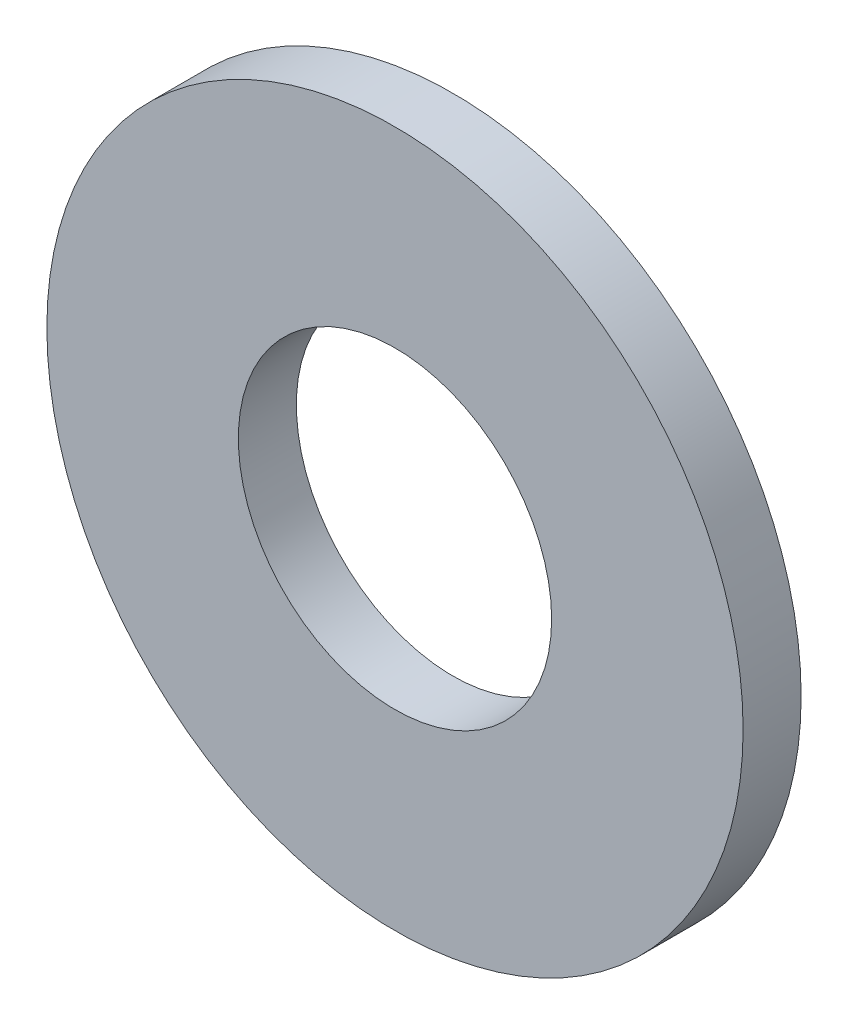
ISO-10303-21;
HEADER;
FILE_DESCRIPTION(('STEP AP214'),'2;1');
FILE_NAME('part.step','',(''),(''),'','','');
FILE_SCHEMA(('AUTOMOTIVE_DESIGN { 1 0 10303 214 1 1 1 1 }'));
ENDSEC;
DATA;
#1=APPLICATION_CONTEXT('core data for automotive mechanical design processes');
#2=APPLICATION_PROTOCOL_DEFINITION('international standard','automotive_design',2000,#1);
#3=PRODUCT_CONTEXT('',#1,'mechanical');
#4=PRODUCT('Part','Part','',(#3));
#5=PRODUCT_RELATED_PRODUCT_CATEGORY('part','',(#4));
#6=PRODUCT_DEFINITION_FORMATION('','',#4);
#7=PRODUCT_DEFINITION_CONTEXT('part definition',#1,'design');
#8=PRODUCT_DEFINITION('design','',#6,#7);
#9=PRODUCT_DEFINITION_SHAPE('','',#8);
#10=(LENGTH_UNIT() NAMED_UNIT(*) SI_UNIT(.MILLI.,.METRE.));
#11=(NAMED_UNIT(*) PLANE_ANGLE_UNIT() SI_UNIT($,.RADIAN.));
#12=(NAMED_UNIT(*) SI_UNIT($,.STERADIAN.) SOLID_ANGLE_UNIT());
#13=UNCERTAINTY_MEASURE_WITH_UNIT(LENGTH_MEASURE(1.E-05),#10,'distance_accuracy_value','');
#14=(GEOMETRIC_REPRESENTATION_CONTEXT(3) GLOBAL_UNCERTAINTY_ASSIGNED_CONTEXT((#13)) GLOBAL_UNIT_ASSIGNED_CONTEXT((#10,
#11,#12)) REPRESENTATION_CONTEXT('',''));
#15=CARTESIAN_POINT('',(0.,0.,0.));
#16=DIRECTION('',(0.,0.,1.));
#17=DIRECTION('',(1.,0.,0.));
#18=AXIS2_PLACEMENT_3D('',#15,#16,#17);
#19=CARTESIAN_POINT('',(0.,0.,0.5));
#20=DIRECTION('',(0.,0.,1.));
#21=DIRECTION('',(1.,0.,0.));
#22=AXIS2_PLACEMENT_3D('',#19,#20,#21);
#23=PLANE('',#22);
#24=CARTESIAN_POINT('',(0.,0.,0.5));
#25=DIRECTION('',(0.,0.,1.));
#26=DIRECTION('',(1.,0.,0.));
#27=AXIS2_PLACEMENT_3D('',#24,#25,#26);
#28=CIRCLE('',#27,3.);
#29=CARTESIAN_POINT('',(3.,0.,0.5));
#30=VERTEX_POINT('',#29);
#31=EDGE_CURVE('E10',#30,#30,#28,.T.);
#32=ORIENTED_EDGE('',*,*,#31,.T.);
#33=EDGE_LOOP('',(#32));
#34=FACE_BOUND('',#33,.T.);
#35=CARTESIAN_POINT('',(0.,0.,0.5));
#36=DIRECTION('',(0.,0.,1.));
#37=DIRECTION('',(1.,0.,0.));
#38=AXIS2_PLACEMENT_3D('',#35,#36,#37);
#39=CIRCLE('',#38,1.35);
#40=CARTESIAN_POINT('',(1.35,0.,0.5));
#41=VERTEX_POINT('',#40);
#42=EDGE_CURVE('E48',#41,#41,#39,.T.);
#43=ORIENTED_EDGE('',*,*,#42,.F.);
#44=EDGE_LOOP('',(#43));
#45=FACE_BOUND('',#44,.T.);
#46=ADVANCED_FACE('F40',(#34,#45),#23,.T.);
#47=CARTESIAN_POINT('',(0.,0.,0.));
#48=DIRECTION('',(0.,0.,1.));
#49=DIRECTION('',(1.,0.,0.));
#50=AXIS2_PLACEMENT_3D('',#47,#48,#49);
#51=PLANE('',#50);
#52=CARTESIAN_POINT('',(0.,0.,0.));
#53=DIRECTION('',(0.,0.,1.));
#54=DIRECTION('',(1.,0.,0.));
#55=AXIS2_PLACEMENT_3D('',#52,#53,#54);
#56=CIRCLE('',#55,3.);
#57=CARTESIAN_POINT('',(3.,0.,0.));
#58=VERTEX_POINT('',#57);
#59=EDGE_CURVE('E41',#58,#58,#56,.T.);
#60=ORIENTED_EDGE('',*,*,#59,.F.);
#61=EDGE_LOOP('',(#60));
#62=FACE_BOUND('',#61,.T.);
#63=CARTESIAN_POINT('',(0.,0.,0.));
#64=DIRECTION('',(0.,0.,1.));
#65=DIRECTION('',(1.,0.,0.));
#66=AXIS2_PLACEMENT_3D('',#63,#64,#65);
#67=CIRCLE('',#66,1.35);
#68=CARTESIAN_POINT('',(1.35,0.,0.));
#69=VERTEX_POINT('',#68);
#70=EDGE_CURVE('E49',#69,#69,#67,.T.);
#71=ORIENTED_EDGE('',*,*,#70,.T.);
#72=EDGE_LOOP('',(#71));
#73=FACE_BOUND('',#72,.T.);
#74=ADVANCED_FACE('F58',(#62,#73),#51,.F.);
#75=CARTESIAN_POINT('',(0.,0.,0.5));
#76=DIRECTION('',(0.,0.,-1.));
#77=DIRECTION('',(-1.,0.,0.));
#78=AXIS2_PLACEMENT_3D('',#75,#76,#77);
#79=CYLINDRICAL_SURFACE('',#78,3.);
#80=ORIENTED_EDGE('',*,*,#31,.F.);
#81=EDGE_LOOP('',(#80));
#82=FACE_BOUND('',#81,.T.);
#83=ORIENTED_EDGE('',*,*,#59,.T.);
#84=EDGE_LOOP('',(#83));
#85=FACE_BOUND('',#84,.T.);
#86=ADVANCED_FACE('F39',(#82,#85),#79,.T.);
#87=CARTESIAN_POINT('',(0.,0.,0.5));
#88=DIRECTION('',(0.,0.,-1.));
#89=DIRECTION('',(-1.,0.,0.));
#90=AXIS2_PLACEMENT_3D('',#87,#88,#89);
#91=CYLINDRICAL_SURFACE('',#90,1.35);
#92=ORIENTED_EDGE('',*,*,#42,.T.);
#93=EDGE_LOOP('',(#92));
#94=FACE_BOUND('',#93,.T.);
#95=ORIENTED_EDGE('',*,*,#70,.F.);
#96=EDGE_LOOP('',(#95));
#97=FACE_BOUND('',#96,.T.);
#98=ADVANCED_FACE('F57',(#94,#97),#91,.F.);
#99=CLOSED_SHELL('',(#46,#74,#86,#98));
#100=MANIFOLD_SOLID_BREP('B2',#99);
#101=ADVANCED_BREP_SHAPE_REPRESENTATION('',(#18,#100),#14);
#102=SHAPE_DEFINITION_REPRESENTATION(#9,#101);
ENDSEC;
END-ISO-10303-21;
